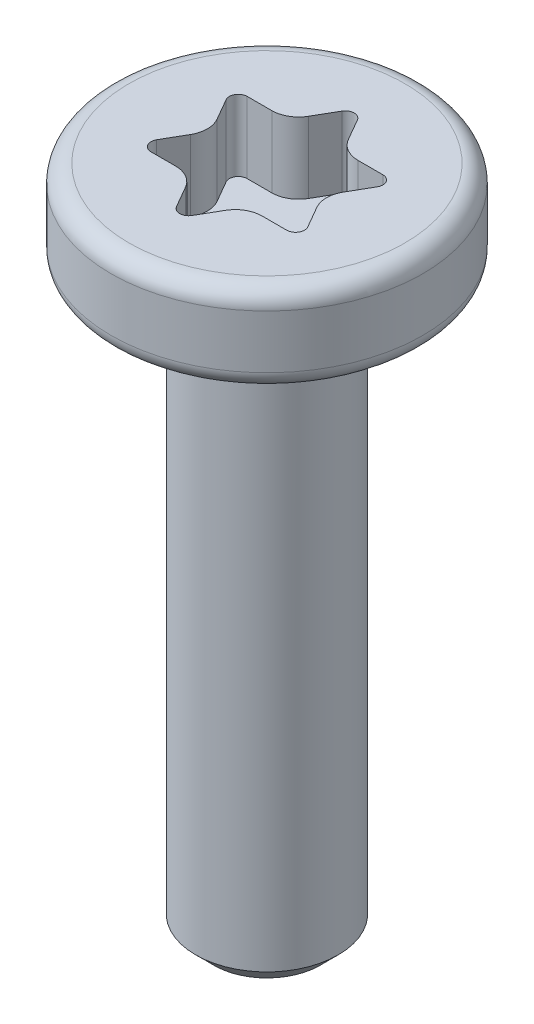
ISO-10303-21;
HEADER;
FILE_DESCRIPTION(('STEP AP214'),'2;1');
FILE_NAME('part.step','',(''),(''),'','','');
FILE_SCHEMA(('AUTOMOTIVE_DESIGN { 1 0 10303 214 1 1 1 1 }'));
ENDSEC;
DATA;
#1=APPLICATION_CONTEXT('core data for automotive mechanical design processes');
#2=APPLICATION_PROTOCOL_DEFINITION('international standard','automotive_design',2000,#1);
#3=PRODUCT_CONTEXT('',#1,'mechanical');
#4=PRODUCT('Part','Part','',(#3));
#5=PRODUCT_RELATED_PRODUCT_CATEGORY('part','',(#4));
#6=PRODUCT_DEFINITION_FORMATION('','',#4);
#7=PRODUCT_DEFINITION_CONTEXT('part definition',#1,'design');
#8=PRODUCT_DEFINITION('design','',#6,#7);
#9=PRODUCT_DEFINITION_SHAPE('','',#8);
#10=(LENGTH_UNIT() NAMED_UNIT(*) SI_UNIT(.MILLI.,.METRE.));
#11=(NAMED_UNIT(*) PLANE_ANGLE_UNIT() SI_UNIT($,.RADIAN.));
#12=(NAMED_UNIT(*) SI_UNIT($,.STERADIAN.) SOLID_ANGLE_UNIT());
#13=UNCERTAINTY_MEASURE_WITH_UNIT(LENGTH_MEASURE(1.E-05),#10,'distance_accuracy_value','');
#14=(GEOMETRIC_REPRESENTATION_CONTEXT(3) GLOBAL_UNCERTAINTY_ASSIGNED_CONTEXT((#13)) GLOBAL_UNIT_ASSIGNED_CONTEXT((#10,
#11,#12)) REPRESENTATION_CONTEXT('',''));
#15=CARTESIAN_POINT('',(0.,0.,0.));
#16=DIRECTION('',(0.,0.,1.));
#17=DIRECTION('',(1.,0.,0.));
#18=AXIS2_PLACEMENT_3D('',#15,#16,#17);
#19=CARTESIAN_POINT('',(0.,0.,0.));
#20=DIRECTION('',(0.,1.,0.));
#21=DIRECTION('',(0.,0.,1.));
#22=AXIS2_PLACEMENT_3D('',#19,#20,#21);
#23=PLANE('',#22);
#24=CARTESIAN_POINT('',(0.,0.,0.));
#25=DIRECTION('',(0.,1.,0.));
#26=DIRECTION('',(0.,0.,1.));
#27=AXIS2_PLACEMENT_3D('',#24,#25,#26);
#28=CIRCLE('',#27,1.55);
#29=CARTESIAN_POINT('',(0.,0.,1.55));
#30=VERTEX_POINT('',#29);
#31=EDGE_CURVE('E241',#30,#30,#28,.F.);
#32=ORIENTED_EDGE('',*,*,#31,.T.);
#33=EDGE_LOOP('',(#32));
#34=FACE_BOUND('',#33,.T.);
#35=CARTESIAN_POINT('',(0.,0.,0.));
#36=DIRECTION('',(0.,1.,0.));
#37=DIRECTION('',(0.,0.,1.));
#38=AXIS2_PLACEMENT_3D('',#35,#36,#37);
#39=CIRCLE('',#38,0.8);
#40=CARTESIAN_POINT('',(0.,0.,0.8));
#41=VERTEX_POINT('',#40);
#42=EDGE_CURVE('E247',#41,#41,#39,.F.);
#43=ORIENTED_EDGE('',*,*,#42,.F.);
#44=EDGE_LOOP('',(#43));
#45=FACE_BOUND('',#44,.T.);
#46=ADVANCED_FACE('F16',(#34,#45),#23,.F.);
#47=CARTESIAN_POINT('',(0.,1.,0.));
#48=DIRECTION('',(0.,-1.,0.));
#49=DIRECTION('',(0.,0.,-1.));
#50=AXIS2_PLACEMENT_3D('',#47,#48,#49);
#51=CYLINDRICAL_SURFACE('',#50,1.75);
#52=CARTESIAN_POINT('',(0.,0.2,0.));
#53=DIRECTION('',(0.,1.,0.));
#54=DIRECTION('',(0.,0.,1.));
#55=AXIS2_PLACEMENT_3D('',#52,#53,#54);
#56=CIRCLE('',#55,1.75);
#57=CARTESIAN_POINT('',(0.,0.2,1.75));
#58=VERTEX_POINT('',#57);
#59=EDGE_CURVE('E238',#58,#58,#56,.T.);
#60=ORIENTED_EDGE('',*,*,#59,.T.);
#61=EDGE_LOOP('',(#60));
#62=FACE_BOUND('',#61,.T.);
#63=CARTESIAN_POINT('',(0.,0.8,0.));
#64=DIRECTION('',(0.,1.,0.));
#65=DIRECTION('',(0.,0.,1.));
#66=AXIS2_PLACEMENT_3D('',#63,#64,#65);
#67=CIRCLE('',#66,1.75);
#68=CARTESIAN_POINT('',(0.,0.8,1.75));
#69=VERTEX_POINT('',#68);
#70=EDGE_CURVE('E235',#69,#69,#67,.F.);
#71=ORIENTED_EDGE('',*,*,#70,.T.);
#72=EDGE_LOOP('',(#71));
#73=FACE_BOUND('',#72,.T.);
#74=ADVANCED_FACE('F383',(#62,#73),#51,.T.);
#75=CARTESIAN_POINT('',(0.,1.,0.));
#76=DIRECTION('',(0.,1.,0.));
#77=DIRECTION('',(0.,0.,1.));
#78=AXIS2_PLACEMENT_3D('',#75,#76,#77);
#79=PLANE('',#78);
#80=DIRECTION('',(1.,0.,0.));
#81=VECTOR('',#80,1.);
#82=CARTESIAN_POINT('',(0.,1.,-0.539703745069974));
#83=LINE('',#82,#81);
#84=CARTESIAN_POINT('',(-0.761589226739509,1.,-0.539703745069974));
#85=VERTEX_POINT('',#84);
#86=CARTESIAN_POINT('',(-0.484803183255687,1.,-0.539703745069974));
#87=VERTEX_POINT('',#86);
#88=EDGE_CURVE('E229',#85,#87,#83,.T.);
#89=ORIENTED_EDGE('',*,*,#88,.T.);
#90=CARTESIAN_POINT('',(-0.484803183255687,1.,-0.839703745069974));
#91=DIRECTION('',(0.,1.,0.));
#92=DIRECTION('',(0.,0.,1.));
#93=AXIS2_PLACEMENT_3D('',#90,#91,#92);
#94=CIRCLE('',#93,0.3);
#95=CARTESIAN_POINT('',(-0.224995562120355,1.,-0.689703745069975));
#96=VERTEX_POINT('',#95);
#97=EDGE_CURVE('E320',#87,#96,#94,.T.);
#98=ORIENTED_EDGE('',*,*,#97,.T.);
#99=DIRECTION('',(-0.5,0.,0.866025403784439));
#100=VECTOR('',#99,1.);
#101=CARTESIAN_POINT('',(-0.467397153748198,1.,-0.269851872534987));
#102=LINE('',#101,#100);
#103=CARTESIAN_POINT('',(-0.0866025403784437,1.,-0.929407490139949));
#104=VERTEX_POINT('',#103);
#105=EDGE_CURVE('E226',#104,#96,#102,.T.);
#106=ORIENTED_EDGE('',*,*,#105,.F.);
#107=CARTESIAN_POINT('',(0.,1.,-0.879407490139948));
#108=DIRECTION('',(0.,1.,0.));
#109=DIRECTION('',(0.,0.,1.));
#110=AXIS2_PLACEMENT_3D('',#107,#108,#109);
#111=CIRCLE('',#110,0.1);
#112=CARTESIAN_POINT('',(0.0866025403784436,1.,-0.929407490139949));
#113=VERTEX_POINT('',#112);
#114=EDGE_CURVE('E303',#104,#113,#111,.F.);
#115=ORIENTED_EDGE('',*,*,#114,.T.);
#116=DIRECTION('',(-0.5,0.,-0.866025403784439));
#117=VECTOR('',#116,1.);
#118=CARTESIAN_POINT('',(0.467397153748198,1.,-0.269851872534987));
#119=LINE('',#118,#117);
#120=CARTESIAN_POINT('',(0.224995562120354,1.,-0.689703745069975));
#121=VERTEX_POINT('',#120);
#122=EDGE_CURVE('E224',#121,#113,#119,.T.);
#123=ORIENTED_EDGE('',*,*,#122,.F.);
#124=CARTESIAN_POINT('',(0.484803183255686,1.,-0.839703745069974));
#125=DIRECTION('',(0.,1.,0.));
#126=DIRECTION('',(0.,0.,1.));
#127=AXIS2_PLACEMENT_3D('',#124,#125,#126);
#128=CIRCLE('',#127,0.3);
#129=CARTESIAN_POINT('',(0.484803183255686,1.,-0.539703745069974));
#130=VERTEX_POINT('',#129);
#131=EDGE_CURVE('E318',#121,#130,#128,.T.);
#132=ORIENTED_EDGE('',*,*,#131,.T.);
#133=DIRECTION('',(1.,0.,0.));
#134=VECTOR('',#133,1.);
#135=CARTESIAN_POINT('',(0.,1.,-0.539703745069974));
#136=LINE('',#135,#134);
#137=CARTESIAN_POINT('',(0.761589226739509,1.,-0.539703745069974));
#138=VERTEX_POINT('',#137);
#139=EDGE_CURVE('E222',#130,#138,#136,.T.);
#140=ORIENTED_EDGE('',*,*,#139,.T.);
#141=CARTESIAN_POINT('',(0.761589226739509,1.,-0.439703745069975));
#142=DIRECTION('',(0.,1.,0.));
#143=DIRECTION('',(0.,0.,1.));
#144=AXIS2_PLACEMENT_3D('',#141,#142,#143);
#145=CIRCLE('',#144,0.1);
#146=CARTESIAN_POINT('',(0.848191767117953,1.,-0.389703745069975));
#147=VERTEX_POINT('',#146);
#148=EDGE_CURVE('E301',#138,#147,#145,.F.);
#149=ORIENTED_EDGE('',*,*,#148,.T.);
#150=DIRECTION('',(-0.5,0.,0.866025403784439));
#151=VECTOR('',#150,1.);
#152=CARTESIAN_POINT('',(0.467397153748198,1.,0.269851872534987));
#153=LINE('',#152,#151);
#154=CARTESIAN_POINT('',(0.709798745376042,1.,-0.15));
#155=VERTEX_POINT('',#154);
#156=EDGE_CURVE('E219',#147,#155,#153,.T.);
#157=ORIENTED_EDGE('',*,*,#156,.T.);
#158=CARTESIAN_POINT('',(0.969606366511373,1.,0.));
#159=DIRECTION('',(0.,1.,0.));
#160=DIRECTION('',(0.,0.,1.));
#161=AXIS2_PLACEMENT_3D('',#158,#159,#160);
#162=CIRCLE('',#161,0.3);
#163=CARTESIAN_POINT('',(0.709798745376042,1.,0.15));
#164=VERTEX_POINT('',#163);
#165=EDGE_CURVE('E316',#155,#164,#162,.T.);
#166=ORIENTED_EDGE('',*,*,#165,.T.);
#167=DIRECTION('',(-0.5,0.,-0.866025403784439));
#168=VECTOR('',#167,1.);
#169=CARTESIAN_POINT('',(0.467397153748198,1.,-0.269851872534987));
#170=LINE('',#169,#168);
#171=CARTESIAN_POINT('',(0.848191767117953,1.,0.389703745069975));
#172=VERTEX_POINT('',#171);
#173=EDGE_CURVE('E216',#172,#164,#170,.T.);
#174=ORIENTED_EDGE('',*,*,#173,.F.);
#175=CARTESIAN_POINT('',(0.761589226739509,1.,0.439703745069975));
#176=DIRECTION('',(0.,1.,0.));
#177=DIRECTION('',(0.,0.,1.));
#178=AXIS2_PLACEMENT_3D('',#175,#176,#177);
#179=CIRCLE('',#178,0.1);
#180=CARTESIAN_POINT('',(0.761589226739509,1.,0.539703745069974));
#181=VERTEX_POINT('',#180);
#182=EDGE_CURVE('E298',#172,#181,#179,.F.);
#183=ORIENTED_EDGE('',*,*,#182,.T.);
#184=DIRECTION('',(1.,0.,0.));
#185=VECTOR('',#184,1.);
#186=CARTESIAN_POINT('',(0.,1.,0.539703745069974));
#187=LINE('',#186,#185);
#188=CARTESIAN_POINT('',(0.484803183255687,1.,0.539703745069974));
#189=VERTEX_POINT('',#188);
#190=EDGE_CURVE('E214',#189,#181,#187,.T.);
#191=ORIENTED_EDGE('',*,*,#190,.F.);
#192=CARTESIAN_POINT('',(0.484803183255687,1.,0.839703745069974));
#193=DIRECTION('',(0.,1.,0.));
#194=DIRECTION('',(0.,0.,1.));
#195=AXIS2_PLACEMENT_3D('',#192,#193,#194);
#196=CIRCLE('',#195,0.3);
#197=CARTESIAN_POINT('',(0.224995562120355,1.,0.689703745069975));
#198=VERTEX_POINT('',#197);
#199=EDGE_CURVE('E314',#189,#198,#196,.T.);
#200=ORIENTED_EDGE('',*,*,#199,.T.);
#201=DIRECTION('',(-0.5,0.,0.866025403784439));
#202=VECTOR('',#201,1.);
#203=CARTESIAN_POINT('',(0.467397153748198,1.,0.269851872534987));
#204=LINE('',#203,#202);
#205=CARTESIAN_POINT('',(0.0866025403784437,1.,0.929407490139949));
#206=VERTEX_POINT('',#205);
#207=EDGE_CURVE('E207',#198,#206,#204,.T.);
#208=ORIENTED_EDGE('',*,*,#207,.T.);
#209=CARTESIAN_POINT('',(0.,1.,0.879407490139949));
#210=DIRECTION('',(0.,1.,0.));
#211=DIRECTION('',(0.,0.,1.));
#212=AXIS2_PLACEMENT_3D('',#209,#210,#211);
#213=CIRCLE('',#212,0.1);
#214=CARTESIAN_POINT('',(-0.0866025403784436,1.,0.929407490139949));
#215=VERTEX_POINT('',#214);
#216=EDGE_CURVE('E187',#206,#215,#213,.F.);
#217=ORIENTED_EDGE('',*,*,#216,.T.);
#218=DIRECTION('',(-0.5,0.,-0.866025403784439));
#219=VECTOR('',#218,1.);
#220=CARTESIAN_POINT('',(-0.467397153748198,1.,0.269851872534987));
#221=LINE('',#220,#219);
#222=CARTESIAN_POINT('',(-0.224995562120355,1.,0.689703745069975));
#223=VERTEX_POINT('',#222);
#224=EDGE_CURVE('E205',#215,#223,#221,.T.);
#225=ORIENTED_EDGE('',*,*,#224,.T.);
#226=CARTESIAN_POINT('',(-0.484803183255686,1.,0.839703745069974));
#227=DIRECTION('',(0.,1.,0.));
#228=DIRECTION('',(0.,0.,1.));
#229=AXIS2_PLACEMENT_3D('',#226,#227,#228);
#230=CIRCLE('',#229,0.3);
#231=CARTESIAN_POINT('',(-0.484803183255686,1.,0.539703745069974));
#232=VERTEX_POINT('',#231);
#233=EDGE_CURVE('E204',#223,#232,#230,.T.);
#234=ORIENTED_EDGE('',*,*,#233,.T.);
#235=DIRECTION('',(1.,0.,0.));
#236=VECTOR('',#235,1.);
#237=CARTESIAN_POINT('',(0.,1.,0.539703745069974));
#238=LINE('',#237,#236);
#239=CARTESIAN_POINT('',(-0.761589226739509,1.,0.539703745069974));
#240=VERTEX_POINT('',#239);
#241=EDGE_CURVE('E194',#240,#232,#238,.T.);
#242=ORIENTED_EDGE('',*,*,#241,.F.);
#243=CARTESIAN_POINT('',(-0.761589226739509,1.,0.439703745069975));
#244=DIRECTION('',(0.,1.,0.));
#245=DIRECTION('',(0.,0.,1.));
#246=AXIS2_PLACEMENT_3D('',#243,#244,#245);
#247=CIRCLE('',#246,0.1);
#248=CARTESIAN_POINT('',(-0.848191767117953,1.,0.389703745069975));
#249=VERTEX_POINT('',#248);
#250=EDGE_CURVE('E177',#240,#249,#247,.F.);
#251=ORIENTED_EDGE('',*,*,#250,.T.);
#252=DIRECTION('',(-0.5,0.,0.866025403784439));
#253=VECTOR('',#252,1.);
#254=CARTESIAN_POINT('',(-0.467397153748198,1.,-0.269851872534987));
#255=LINE('',#254,#253);
#256=CARTESIAN_POINT('',(-0.709798745376042,1.,0.15));
#257=VERTEX_POINT('',#256);
#258=EDGE_CURVE('E233',#257,#249,#255,.T.);
#259=ORIENTED_EDGE('',*,*,#258,.F.);
#260=CARTESIAN_POINT('',(-0.969606366511373,1.,0.));
#261=DIRECTION('',(0.,1.,0.));
#262=DIRECTION('',(0.,0.,1.));
#263=AXIS2_PLACEMENT_3D('',#260,#261,#262);
#264=CIRCLE('',#263,0.3);
#265=CARTESIAN_POINT('',(-0.709798745376042,1.,-0.15));
#266=VERTEX_POINT('',#265);
#267=EDGE_CURVE('E311',#257,#266,#264,.T.);
#268=ORIENTED_EDGE('',*,*,#267,.T.);
#269=DIRECTION('',(-0.5,0.,-0.866025403784439));
#270=VECTOR('',#269,1.);
#271=CARTESIAN_POINT('',(-0.467397153748198,1.,0.269851872534987));
#272=LINE('',#271,#270);
#273=CARTESIAN_POINT('',(-0.848191767117953,1.,-0.389703745069975));
#274=VERTEX_POINT('',#273);
#275=EDGE_CURVE('E231',#266,#274,#272,.T.);
#276=ORIENTED_EDGE('',*,*,#275,.T.);
#277=CARTESIAN_POINT('',(-0.761589226739509,1.,-0.439703745069974));
#278=DIRECTION('',(0.,1.,0.));
#279=DIRECTION('',(0.,0.,1.));
#280=AXIS2_PLACEMENT_3D('',#277,#278,#279);
#281=CIRCLE('',#280,0.1);
#282=EDGE_CURVE('E306',#274,#85,#281,.F.);
#283=ORIENTED_EDGE('',*,*,#282,.T.);
#284=EDGE_LOOP('',(#89,#98,#106,#115,#123,#132,#140,#149,#157,#166,#174,#183,#191,#200,#208,
#217,#225,#234,#242,#251,#259,#268,#276,#283));
#285=FACE_BOUND('',#284,.T.);
#286=CARTESIAN_POINT('',(0.,1.,0.));
#287=DIRECTION('',(0.,1.,0.));
#288=DIRECTION('',(0.,0.,1.));
#289=AXIS2_PLACEMENT_3D('',#286,#287,#288);
#290=CIRCLE('',#289,1.55);
#291=CARTESIAN_POINT('',(0.,1.,1.55));
#292=VERTEX_POINT('',#291);
#293=EDGE_CURVE('E244',#292,#292,#290,.T.);
#294=ORIENTED_EDGE('',*,*,#293,.T.);
#295=EDGE_LOOP('',(#294));
#296=FACE_BOUND('',#295,.T.);
#297=ADVANCED_FACE('F201',(#285,#296),#79,.T.);
#298=CARTESIAN_POINT('',(0.,0.2,0.));
#299=DIRECTION('',(0.,1.,0.));
#300=DIRECTION('',(0.,0.,1.));
#301=AXIS2_PLACEMENT_3D('',#298,#299,#300);
#302=TOROIDAL_SURFACE('',#301,1.55,0.2);
#303=ORIENTED_EDGE('',*,*,#31,.F.);
#304=EDGE_LOOP('',(#303));
#305=FACE_BOUND('',#304,.T.);
#306=ORIENTED_EDGE('',*,*,#59,.F.);
#307=EDGE_LOOP('',(#306));
#308=FACE_BOUND('',#307,.T.);
#309=ADVANCED_FACE('F396',(#305,#308),#302,.T.);
#310=CARTESIAN_POINT('',(0.,0.8,0.));
#311=DIRECTION('',(0.,1.,0.));
#312=DIRECTION('',(0.,0.,1.));
#313=AXIS2_PLACEMENT_3D('',#310,#311,#312);
#314=TOROIDAL_SURFACE('',#313,1.55,0.2);
#315=ORIENTED_EDGE('',*,*,#70,.F.);
#316=EDGE_LOOP('',(#315));
#317=FACE_BOUND('',#316,.T.);
#318=ORIENTED_EDGE('',*,*,#293,.F.);
#319=EDGE_LOOP('',(#318));
#320=FACE_BOUND('',#319,.T.);
#321=ADVANCED_FACE('F399',(#317,#320),#314,.T.);
#322=CARTESIAN_POINT('',(0.,-6.5,0.));
#323=DIRECTION('',(0.,1.,0.));
#324=DIRECTION('',(0.,0.,1.));
#325=AXIS2_PLACEMENT_3D('',#322,#323,#324);
#326=CYLINDRICAL_SURFACE('',#325,0.8);
#327=CARTESIAN_POINT('',(0.,-6.3,0.));
#328=DIRECTION('',(0.,-1.,0.));
#329=DIRECTION('',(0.,0.,-1.));
#330=AXIS2_PLACEMENT_3D('',#327,#328,#329);
#331=CIRCLE('',#330,0.8);
#332=CARTESIAN_POINT('',(0.,-6.3,-0.8));
#333=VERTEX_POINT('',#332);
#334=EDGE_CURVE('E198',#333,#333,#331,.F.);
#335=ORIENTED_EDGE('',*,*,#334,.T.);
#336=EDGE_LOOP('',(#335));
#337=FACE_BOUND('',#336,.T.);
#338=ORIENTED_EDGE('',*,*,#42,.T.);
#339=EDGE_LOOP('',(#338));
#340=FACE_BOUND('',#339,.T.);
#341=ADVANCED_FACE('F403',(#337,#340),#326,.T.);
#342=CARTESIAN_POINT('',(0.,-6.5,0.));
#343=DIRECTION('',(0.,-1.,0.));
#344=DIRECTION('',(0.,0.,-1.));
#345=AXIS2_PLACEMENT_3D('',#342,#343,#344);
#346=PLANE('',#345);
#347=CARTESIAN_POINT('',(0.,-6.5,0.));
#348=DIRECTION('',(0.,-1.,0.));
#349=DIRECTION('',(0.,0.,-1.));
#350=AXIS2_PLACEMENT_3D('',#347,#348,#349);
#351=CIRCLE('',#350,0.6);
#352=CARTESIAN_POINT('',(0.,-6.5,-0.6));
#353=VERTEX_POINT('',#352);
#354=EDGE_CURVE('E250',#353,#353,#351,.T.);
#355=ORIENTED_EDGE('',*,*,#354,.T.);
#356=EDGE_LOOP('',(#355));
#357=FACE_BOUND('',#356,.T.);
#358=ADVANCED_FACE('F408',(#357),#346,.T.);
#359=CARTESIAN_POINT('',(0.,-6.5,0.));
#360=DIRECTION('',(0.,1.,0.));
#361=DIRECTION('',(0.,0.,1.));
#362=AXIS2_PLACEMENT_3D('',#359,#360,#361);
#363=CONICAL_SURFACE('',#362,0.6,0.785398163397448);
#364=ORIENTED_EDGE('',*,*,#334,.F.);
#365=EDGE_LOOP('',(#364));
#366=FACE_BOUND('',#365,.T.);
#367=ORIENTED_EDGE('',*,*,#354,.F.);
#368=EDGE_LOOP('',(#367));
#369=FACE_BOUND('',#368,.T.);
#370=ADVANCED_FACE('F405',(#366,#369),#363,.T.);
#371=CARTESIAN_POINT('',(0.,0.2,0.539703745069974));
#372=DIRECTION('',(0.,0.,1.));
#373=DIRECTION('',(1.,0.,0.));
#374=AXIS2_PLACEMENT_3D('',#371,#372,#373);
#375=PLANE('',#374);
#376=ORIENTED_EDGE('',*,*,#241,.T.);
#377=DIRECTION('',(0.,1.,0.));
#378=VECTOR('',#377,1.);
#379=CARTESIAN_POINT('',(-0.484803183255686,0.2,0.539703745069974));
#380=LINE('',#379,#378);
#381=CARTESIAN_POINT('',(-0.484803183255686,0.2,0.539703745069974));
#382=VERTEX_POINT('',#381);
#383=EDGE_CURVE('E342',#232,#382,#380,.F.);
#384=ORIENTED_EDGE('',*,*,#383,.T.);
#385=DIRECTION('',(1.,0.,0.));
#386=VECTOR('',#385,1.);
#387=CARTESIAN_POINT('',(0.,0.2,0.539703745069974));
#388=LINE('',#387,#386);
#389=CARTESIAN_POINT('',(-0.761589226739509,0.2,0.539703745069974));
#390=VERTEX_POINT('',#389);
#391=EDGE_CURVE('E197',#390,#382,#388,.T.);
#392=ORIENTED_EDGE('',*,*,#391,.F.);
#393=DIRECTION('',(0.,1.,0.));
#394=VECTOR('',#393,1.);
#395=CARTESIAN_POINT('',(-0.761589226739509,1.,0.539703745069974));
#396=LINE('',#395,#394);
#397=EDGE_CURVE('E181',#390,#240,#396,.T.);
#398=ORIENTED_EDGE('',*,*,#397,.T.);
#399=EDGE_LOOP('',(#376,#384,#392,#398));
#400=FACE_BOUND('',#399,.T.);
#401=ADVANCED_FACE('F193',(#400),#375,.F.);
#402=CARTESIAN_POINT('',(-0.467397153748198,0.2,-0.269851872534987));
#403=DIRECTION('',(-0.866025403784439,0.,-0.5));
#404=DIRECTION('',(-0.5,0.,0.866025403784439));
#405=AXIS2_PLACEMENT_3D('',#402,#403,#404);
#406=PLANE('',#405);
#407=DIRECTION('',(-0.5,0.,0.866025403784439));
#408=VECTOR('',#407,1.);
#409=CARTESIAN_POINT('',(-0.467397153748198,0.2,-0.269851872534987));
#410=LINE('',#409,#408);
#411=CARTESIAN_POINT('',(-0.709798745376042,0.2,0.15));
#412=VERTEX_POINT('',#411);
#413=CARTESIAN_POINT('',(-0.848191767117953,0.2,0.389703745069975));
#414=VERTEX_POINT('',#413);
#415=EDGE_CURVE('E210',#412,#414,#410,.T.);
#416=ORIENTED_EDGE('',*,*,#415,.F.);
#417=DIRECTION('',(0.,1.,0.));
#418=VECTOR('',#417,1.);
#419=CARTESIAN_POINT('',(-0.709798745376042,1.,0.15));
#420=LINE('',#419,#418);
#421=EDGE_CURVE('E344',#412,#257,#420,.T.);
#422=ORIENTED_EDGE('',*,*,#421,.T.);
#423=ORIENTED_EDGE('',*,*,#258,.T.);
#424=DIRECTION('',(0.,1.,0.));
#425=VECTOR('',#424,1.);
#426=CARTESIAN_POINT('',(-0.848191767117953,0.2,0.389703745069975));
#427=LINE('',#426,#425);
#428=EDGE_CURVE('E183',#249,#414,#427,.F.);
#429=ORIENTED_EDGE('',*,*,#428,.T.);
#430=EDGE_LOOP('',(#416,#422,#423,#429));
#431=FACE_BOUND('',#430,.T.);
#432=ADVANCED_FACE('F476',(#431),#406,.F.);
#433=CARTESIAN_POINT('',(-0.467397153748198,0.2,0.269851872534987));
#434=DIRECTION('',(0.866025403784439,0.,-0.5));
#435=DIRECTION('',(-0.5,0.,-0.866025403784439));
#436=AXIS2_PLACEMENT_3D('',#433,#434,#435);
#437=PLANE('',#436);
#438=ORIENTED_EDGE('',*,*,#275,.F.);
#439=DIRECTION('',(0.,1.,0.));
#440=VECTOR('',#439,1.);
#441=CARTESIAN_POINT('',(-0.709798745376042,0.2,-0.15));
#442=LINE('',#441,#440);
#443=CARTESIAN_POINT('',(-0.709798745376042,0.2,-0.15));
#444=VERTEX_POINT('',#443);
#445=EDGE_CURVE('E31',#266,#444,#442,.F.);
#446=ORIENTED_EDGE('',*,*,#445,.T.);
#447=DIRECTION('',(-0.5,0.,-0.866025403784439));
#448=VECTOR('',#447,1.);
#449=CARTESIAN_POINT('',(-0.467397153748198,0.2,0.269851872534987));
#450=LINE('',#449,#448);
#451=CARTESIAN_POINT('',(-0.848191767117953,0.2,-0.389703745069975));
#452=VERTEX_POINT('',#451);
#453=EDGE_CURVE('E473',#444,#452,#450,.T.);
#454=ORIENTED_EDGE('',*,*,#453,.T.);
#455=DIRECTION('',(0.,1.,0.));
#456=VECTOR('',#455,1.);
#457=CARTESIAN_POINT('',(-0.848191767117953,1.,-0.389703745069974));
#458=LINE('',#457,#456);
#459=EDGE_CURVE('E293',#452,#274,#458,.T.);
#460=ORIENTED_EDGE('',*,*,#459,.T.);
#461=EDGE_LOOP('',(#438,#446,#454,#460));
#462=FACE_BOUND('',#461,.T.);
#463=ADVANCED_FACE('F478',(#462),#437,.T.);
#464=CARTESIAN_POINT('',(0.,0.2,-0.539703745069974));
#465=DIRECTION('',(0.,0.,1.));
#466=DIRECTION('',(1.,0.,0.));
#467=AXIS2_PLACEMENT_3D('',#464,#465,#466);
#468=PLANE('',#467);
#469=DIRECTION('',(1.,0.,0.));
#470=VECTOR('',#469,1.);
#471=CARTESIAN_POINT('',(0.,0.2,-0.539703745069974));
#472=LINE('',#471,#470);
#473=CARTESIAN_POINT('',(-0.761589226739509,0.2,-0.539703745069974));
#474=VERTEX_POINT('',#473);
#475=CARTESIAN_POINT('',(-0.484803183255687,0.2,-0.539703745069974));
#476=VERTEX_POINT('',#475);
#477=EDGE_CURVE('E471',#474,#476,#472,.T.);
#478=ORIENTED_EDGE('',*,*,#477,.T.);
#479=DIRECTION('',(0.,1.,0.));
#480=VECTOR('',#479,1.);
#481=CARTESIAN_POINT('',(-0.484803183255687,1.,-0.539703745069974));
#482=LINE('',#481,#480);
#483=EDGE_CURVE('E308',#476,#87,#482,.T.);
#484=ORIENTED_EDGE('',*,*,#483,.T.);
#485=ORIENTED_EDGE('',*,*,#88,.F.);
#486=DIRECTION('',(0.,1.,0.));
#487=VECTOR('',#486,1.);
#488=CARTESIAN_POINT('',(-0.761589226739509,0.2,-0.539703745069974));
#489=LINE('',#488,#487);
#490=EDGE_CURVE('E188',#85,#474,#489,.F.);
#491=ORIENTED_EDGE('',*,*,#490,.T.);
#492=EDGE_LOOP('',(#478,#484,#485,#491));
#493=FACE_BOUND('',#492,.T.);
#494=ADVANCED_FACE('F484',(#493),#468,.T.);
#495=CARTESIAN_POINT('',(-0.467397153748198,0.2,-0.269851872534987));
#496=DIRECTION('',(-0.866025403784439,0.,-0.5));
#497=DIRECTION('',(-0.5,0.,0.866025403784439));
#498=AXIS2_PLACEMENT_3D('',#495,#496,#497);
#499=PLANE('',#498);
#500=ORIENTED_EDGE('',*,*,#105,.T.);
#501=DIRECTION('',(0.,1.,0.));
#502=VECTOR('',#501,1.);
#503=CARTESIAN_POINT('',(-0.224995562120355,0.2,-0.689703745069974));
#504=LINE('',#503,#502);
#505=CARTESIAN_POINT('',(-0.224995562120355,0.2,-0.689703745069975));
#506=VERTEX_POINT('',#505);
#507=EDGE_CURVE('E322',#96,#506,#504,.F.);
#508=ORIENTED_EDGE('',*,*,#507,.T.);
#509=DIRECTION('',(-0.5,0.,0.866025403784439));
#510=VECTOR('',#509,1.);
#511=CARTESIAN_POINT('',(-0.467397153748198,0.2,-0.269851872534987));
#512=LINE('',#511,#510);
#513=CARTESIAN_POINT('',(-0.0866025403784437,0.2,-0.929407490139949));
#514=VERTEX_POINT('',#513);
#515=EDGE_CURVE('E468',#514,#506,#512,.T.);
#516=ORIENTED_EDGE('',*,*,#515,.F.);
#517=DIRECTION('',(0.,1.,0.));
#518=VECTOR('',#517,1.);
#519=CARTESIAN_POINT('',(-0.0866025403784439,1.,-0.929407490139948));
#520=LINE('',#519,#518);
#521=EDGE_CURVE('E287',#514,#104,#520,.T.);
#522=ORIENTED_EDGE('',*,*,#521,.T.);
#523=EDGE_LOOP('',(#500,#508,#516,#522));
#524=FACE_BOUND('',#523,.T.);
#525=ADVANCED_FACE('F491',(#524),#499,.F.);
#526=CARTESIAN_POINT('',(0.467397153748198,0.2,-0.269851872534987));
#527=DIRECTION('',(0.866025403784439,0.,-0.5));
#528=DIRECTION('',(-0.5,0.,-0.866025403784439));
#529=AXIS2_PLACEMENT_3D('',#526,#527,#528);
#530=PLANE('',#529);
#531=DIRECTION('',(-0.5,0.,-0.866025403784439));
#532=VECTOR('',#531,1.);
#533=CARTESIAN_POINT('',(0.467397153748198,0.2,-0.269851872534987));
#534=LINE('',#533,#532);
#535=CARTESIAN_POINT('',(0.224995562120354,0.2,-0.689703745069975));
#536=VERTEX_POINT('',#535);
#537=CARTESIAN_POINT('',(0.0866025403784436,0.2,-0.929407490139949));
#538=VERTEX_POINT('',#537);
#539=EDGE_CURVE('E461',#536,#538,#534,.T.);
#540=ORIENTED_EDGE('',*,*,#539,.F.);
#541=DIRECTION('',(0.,1.,0.));
#542=VECTOR('',#541,1.);
#543=CARTESIAN_POINT('',(0.224995562120354,1.,-0.689703745069974));
#544=LINE('',#543,#542);
#545=EDGE_CURVE('E324',#536,#121,#544,.T.);
#546=ORIENTED_EDGE('',*,*,#545,.T.);
#547=ORIENTED_EDGE('',*,*,#122,.T.);
#548=DIRECTION('',(0.,1.,0.));
#549=VECTOR('',#548,1.);
#550=CARTESIAN_POINT('',(0.0866025403784438,0.2,-0.929407490139948));
#551=LINE('',#550,#549);
#552=EDGE_CURVE('E290',#113,#538,#551,.F.);
#553=ORIENTED_EDGE('',*,*,#552,.T.);
#554=EDGE_LOOP('',(#540,#546,#547,#553));
#555=FACE_BOUND('',#554,.T.);
#556=ADVANCED_FACE('F500',(#555),#530,.F.);
#557=CARTESIAN_POINT('',(0.,0.2,-0.539703745069974));
#558=DIRECTION('',(0.,0.,1.));
#559=DIRECTION('',(1.,0.,0.));
#560=AXIS2_PLACEMENT_3D('',#557,#558,#559);
#561=PLANE('',#560);
#562=ORIENTED_EDGE('',*,*,#139,.F.);
#563=DIRECTION('',(0.,1.,0.));
#564=VECTOR('',#563,1.);
#565=CARTESIAN_POINT('',(0.484803183255686,0.2,-0.539703745069974));
#566=LINE('',#565,#564);
#567=CARTESIAN_POINT('',(0.484803183255686,0.2,-0.539703745069974));
#568=VERTEX_POINT('',#567);
#569=EDGE_CURVE('E327',#130,#568,#566,.F.);
#570=ORIENTED_EDGE('',*,*,#569,.T.);
#571=DIRECTION('',(1.,0.,0.));
#572=VECTOR('',#571,1.);
#573=CARTESIAN_POINT('',(0.,0.2,-0.539703745069974));
#574=LINE('',#573,#572);
#575=CARTESIAN_POINT('',(0.761589226739509,0.2,-0.539703745069974));
#576=VERTEX_POINT('',#575);
#577=EDGE_CURVE('E459',#568,#576,#574,.T.);
#578=ORIENTED_EDGE('',*,*,#577,.T.);
#579=DIRECTION('',(0.,1.,0.));
#580=VECTOR('',#579,1.);
#581=CARTESIAN_POINT('',(0.761589226739509,1.,-0.539703745069974));
#582=LINE('',#581,#580);
#583=EDGE_CURVE('E282',#576,#138,#582,.T.);
#584=ORIENTED_EDGE('',*,*,#583,.T.);
#585=EDGE_LOOP('',(#562,#570,#578,#584));
#586=FACE_BOUND('',#585,.T.);
#587=ADVANCED_FACE('F506',(#586),#561,.T.);
#588=CARTESIAN_POINT('',(0.467397153748198,0.2,0.269851872534987));
#589=DIRECTION('',(-0.866025403784439,0.,-0.5));
#590=DIRECTION('',(-0.5,0.,0.866025403784439));
#591=AXIS2_PLACEMENT_3D('',#588,#589,#590);
#592=PLANE('',#591);
#593=DIRECTION('',(-0.5,0.,0.866025403784439));
#594=VECTOR('',#593,1.);
#595=CARTESIAN_POINT('',(0.467397153748198,0.2,0.269851872534987));
#596=LINE('',#595,#594);
#597=CARTESIAN_POINT('',(0.848191767117953,0.2,-0.389703745069975));
#598=VERTEX_POINT('',#597);
#599=CARTESIAN_POINT('',(0.709798745376042,0.2,-0.15));
#600=VERTEX_POINT('',#599);
#601=EDGE_CURVE('E451',#598,#600,#596,.T.);
#602=ORIENTED_EDGE('',*,*,#601,.T.);
#603=DIRECTION('',(0.,1.,0.));
#604=VECTOR('',#603,1.);
#605=CARTESIAN_POINT('',(0.709798745376042,1.,-0.15));
#606=LINE('',#605,#604);
#607=EDGE_CURVE('E329',#600,#155,#606,.T.);
#608=ORIENTED_EDGE('',*,*,#607,.T.);
#609=ORIENTED_EDGE('',*,*,#156,.F.);
#610=DIRECTION('',(0.,1.,0.));
#611=VECTOR('',#610,1.);
#612=CARTESIAN_POINT('',(0.848191767117953,0.2,-0.389703745069975));
#613=LINE('',#612,#611);
#614=EDGE_CURVE('E285',#147,#598,#613,.F.);
#615=ORIENTED_EDGE('',*,*,#614,.T.);
#616=EDGE_LOOP('',(#602,#608,#609,#615));
#617=FACE_BOUND('',#616,.T.);
#618=ADVANCED_FACE('F456',(#617),#592,.T.);
#619=CARTESIAN_POINT('',(0.467397153748198,0.2,-0.269851872534987));
#620=DIRECTION('',(0.866025403784439,0.,-0.5));
#621=DIRECTION('',(-0.5,0.,-0.866025403784439));
#622=AXIS2_PLACEMENT_3D('',#619,#620,#621);
#623=PLANE('',#622);
#624=ORIENTED_EDGE('',*,*,#173,.T.);
#625=DIRECTION('',(0.,1.,0.));
#626=VECTOR('',#625,1.);
#627=CARTESIAN_POINT('',(0.709798745376042,0.2,0.15));
#628=LINE('',#627,#626);
#629=CARTESIAN_POINT('',(0.709798745376042,0.2,0.15));
#630=VERTEX_POINT('',#629);
#631=EDGE_CURVE('E332',#164,#630,#628,.F.);
#632=ORIENTED_EDGE('',*,*,#631,.T.);
#633=DIRECTION('',(-0.5,0.,-0.866025403784439));
#634=VECTOR('',#633,1.);
#635=CARTESIAN_POINT('',(0.467397153748198,0.2,-0.269851872534987));
#636=LINE('',#635,#634);
#637=CARTESIAN_POINT('',(0.848191767117953,0.2,0.389703745069975));
#638=VERTEX_POINT('',#637);
#639=EDGE_CURVE('E454',#638,#630,#636,.T.);
#640=ORIENTED_EDGE('',*,*,#639,.F.);
#641=DIRECTION('',(0.,1.,0.));
#642=VECTOR('',#641,1.);
#643=CARTESIAN_POINT('',(0.848191767117953,1.,0.389703745069975));
#644=LINE('',#643,#642);
#645=EDGE_CURVE('E276',#638,#172,#644,.T.);
#646=ORIENTED_EDGE('',*,*,#645,.T.);
#647=EDGE_LOOP('',(#624,#632,#640,#646));
#648=FACE_BOUND('',#647,.T.);
#649=ADVANCED_FACE('F511',(#648),#623,.F.);
#650=CARTESIAN_POINT('',(0.,0.2,0.539703745069974));
#651=DIRECTION('',(0.,0.,1.));
#652=DIRECTION('',(1.,0.,0.));
#653=AXIS2_PLACEMENT_3D('',#650,#651,#652);
#654=PLANE('',#653);
#655=DIRECTION('',(1.,0.,0.));
#656=VECTOR('',#655,1.);
#657=CARTESIAN_POINT('',(0.,0.2,0.539703745069974));
#658=LINE('',#657,#656);
#659=CARTESIAN_POINT('',(0.484803183255687,0.2,0.539703745069974));
#660=VERTEX_POINT('',#659);
#661=CARTESIAN_POINT('',(0.761589226739509,0.2,0.539703745069974));
#662=VERTEX_POINT('',#661);
#663=EDGE_CURVE('E463',#660,#662,#658,.T.);
#664=ORIENTED_EDGE('',*,*,#663,.F.);
#665=DIRECTION('',(0.,1.,0.));
#666=VECTOR('',#665,1.);
#667=CARTESIAN_POINT('',(0.484803183255687,1.,0.539703745069974));
#668=LINE('',#667,#666);
#669=EDGE_CURVE('E334',#660,#189,#668,.T.);
#670=ORIENTED_EDGE('',*,*,#669,.T.);
#671=ORIENTED_EDGE('',*,*,#190,.T.);
#672=DIRECTION('',(0.,1.,0.));
#673=VECTOR('',#672,1.);
#674=CARTESIAN_POINT('',(0.761589226739509,0.2,0.539703745069974));
#675=LINE('',#674,#673);
#676=EDGE_CURVE('E279',#181,#662,#675,.F.);
#677=ORIENTED_EDGE('',*,*,#676,.T.);
#678=EDGE_LOOP('',(#664,#670,#671,#677));
#679=FACE_BOUND('',#678,.T.);
#680=ADVANCED_FACE('F519',(#679),#654,.F.);
#681=CARTESIAN_POINT('',(0.467397153748198,0.2,0.269851872534987));
#682=DIRECTION('',(-0.866025403784439,0.,-0.5));
#683=DIRECTION('',(-0.5,0.,0.866025403784439));
#684=AXIS2_PLACEMENT_3D('',#681,#682,#683);
#685=PLANE('',#684);
#686=ORIENTED_EDGE('',*,*,#207,.F.);
#687=DIRECTION('',(0.,1.,0.));
#688=VECTOR('',#687,1.);
#689=CARTESIAN_POINT('',(0.224995562120355,0.2,0.689703745069974));
#690=LINE('',#689,#688);
#691=CARTESIAN_POINT('',(0.224995562120355,0.2,0.689703745069975));
#692=VERTEX_POINT('',#691);
#693=EDGE_CURVE('E337',#198,#692,#690,.F.);
#694=ORIENTED_EDGE('',*,*,#693,.T.);
#695=DIRECTION('',(-0.5,0.,0.866025403784439));
#696=VECTOR('',#695,1.);
#697=CARTESIAN_POINT('',(0.467397153748198,0.2,0.269851872534987));
#698=LINE('',#697,#696);
#699=CARTESIAN_POINT('',(0.0866025403784437,0.2,0.929407490139949));
#700=VERTEX_POINT('',#699);
#701=EDGE_CURVE('E367',#692,#700,#698,.T.);
#702=ORIENTED_EDGE('',*,*,#701,.T.);
#703=DIRECTION('',(0.,1.,0.));
#704=VECTOR('',#703,1.);
#705=CARTESIAN_POINT('',(0.0866025403784439,1.,0.929407490139949));
#706=LINE('',#705,#704);
#707=EDGE_CURVE('E271',#700,#206,#706,.T.);
#708=ORIENTED_EDGE('',*,*,#707,.T.);
#709=EDGE_LOOP('',(#686,#694,#702,#708));
#710=FACE_BOUND('',#709,.T.);
#711=ADVANCED_FACE('F525',(#710),#685,.T.);
#712=CARTESIAN_POINT('',(-0.467397153748198,0.2,0.269851872534987));
#713=DIRECTION('',(0.866025403784439,0.,-0.5));
#714=DIRECTION('',(-0.5,0.,-0.866025403784439));
#715=AXIS2_PLACEMENT_3D('',#712,#713,#714);
#716=PLANE('',#715);
#717=DIRECTION('',(-0.5,0.,-0.866025403784439));
#718=VECTOR('',#717,1.);
#719=CARTESIAN_POINT('',(-0.467397153748198,0.2,0.269851872534987));
#720=LINE('',#719,#718);
#721=CARTESIAN_POINT('',(-0.0866025403784436,0.2,0.929407490139949));
#722=VERTEX_POINT('',#721);
#723=CARTESIAN_POINT('',(-0.224995562120355,0.2,0.689703745069975));
#724=VERTEX_POINT('',#723);
#725=EDGE_CURVE('E359',#722,#724,#720,.T.);
#726=ORIENTED_EDGE('',*,*,#725,.T.);
#727=DIRECTION('',(0.,1.,0.));
#728=VECTOR('',#727,1.);
#729=CARTESIAN_POINT('',(-0.224995562120355,1.,0.689703745069974));
#730=LINE('',#729,#728);
#731=EDGE_CURVE('E339',#724,#223,#730,.T.);
#732=ORIENTED_EDGE('',*,*,#731,.T.);
#733=ORIENTED_EDGE('',*,*,#224,.F.);
#734=DIRECTION('',(0.,1.,0.));
#735=VECTOR('',#734,1.);
#736=CARTESIAN_POINT('',(-0.0866025403784438,0.2,0.929407490139949));
#737=LINE('',#736,#735);
#738=EDGE_CURVE('E274',#215,#722,#737,.F.);
#739=ORIENTED_EDGE('',*,*,#738,.T.);
#740=EDGE_LOOP('',(#726,#732,#733,#739));
#741=FACE_BOUND('',#740,.T.);
#742=ADVANCED_FACE('F364',(#741),#716,.T.);
#743=CARTESIAN_POINT('',(0.,0.2,0.));
#744=DIRECTION('',(0.,1.,0.));
#745=DIRECTION('',(0.,0.,1.));
#746=AXIS2_PLACEMENT_3D('',#743,#744,#745);
#747=PLANE('',#746);
#748=ORIENTED_EDGE('',*,*,#453,.F.);
#749=CARTESIAN_POINT('',(-0.969606366511373,0.2,0.));
#750=DIRECTION('',(0.,1.,0.));
#751=DIRECTION('',(0.,0.,1.));
#752=AXIS2_PLACEMENT_3D('',#749,#750,#751);
#753=CIRCLE('',#752,0.3);
#754=EDGE_CURVE('E11',#444,#412,#753,.F.);
#755=ORIENTED_EDGE('',*,*,#754,.T.);
#756=ORIENTED_EDGE('',*,*,#415,.T.);
#757=CARTESIAN_POINT('',(-0.761589226739509,0.2,0.439703745069975));
#758=DIRECTION('',(0.,1.,0.));
#759=DIRECTION('',(0.,0.,1.));
#760=AXIS2_PLACEMENT_3D('',#757,#758,#759);
#761=CIRCLE('',#760,0.1);
#762=EDGE_CURVE('E269',#414,#390,#761,.T.);
#763=ORIENTED_EDGE('',*,*,#762,.T.);
#764=ORIENTED_EDGE('',*,*,#391,.T.);
#765=CARTESIAN_POINT('',(-0.484803183255686,0.2,0.839703745069974));
#766=DIRECTION('',(0.,1.,0.));
#767=DIRECTION('',(0.,0.,1.));
#768=AXIS2_PLACEMENT_3D('',#765,#766,#767);
#769=CIRCLE('',#768,0.3);
#770=EDGE_CURVE('E24',#382,#724,#769,.F.);
#771=ORIENTED_EDGE('',*,*,#770,.T.);
#772=ORIENTED_EDGE('',*,*,#725,.F.);
#773=CARTESIAN_POINT('',(0.,0.2,0.879407490139949));
#774=DIRECTION('',(0.,1.,0.));
#775=DIRECTION('',(0.,0.,1.));
#776=AXIS2_PLACEMENT_3D('',#773,#774,#775);
#777=CIRCLE('',#776,0.1);
#778=EDGE_CURVE('E266',#722,#700,#777,.T.);
#779=ORIENTED_EDGE('',*,*,#778,.T.);
#780=ORIENTED_EDGE('',*,*,#701,.F.);
#781=CARTESIAN_POINT('',(0.484803183255687,0.2,0.839703745069974));
#782=DIRECTION('',(0.,1.,0.));
#783=DIRECTION('',(0.,0.,1.));
#784=AXIS2_PLACEMENT_3D('',#781,#782,#783);
#785=CIRCLE('',#784,0.3);
#786=EDGE_CURVE('E354',#692,#660,#785,.F.);
#787=ORIENTED_EDGE('',*,*,#786,.T.);
#788=ORIENTED_EDGE('',*,*,#663,.T.);
#789=CARTESIAN_POINT('',(0.761589226739509,0.2,0.439703745069975));
#790=DIRECTION('',(0.,1.,0.));
#791=DIRECTION('',(0.,0.,1.));
#792=AXIS2_PLACEMENT_3D('',#789,#790,#791);
#793=CIRCLE('',#792,0.1);
#794=EDGE_CURVE('E264',#662,#638,#793,.T.);
#795=ORIENTED_EDGE('',*,*,#794,.T.);
#796=ORIENTED_EDGE('',*,*,#639,.T.);
#797=CARTESIAN_POINT('',(0.969606366511373,0.2,0.));
#798=DIRECTION('',(0.,1.,0.));
#799=DIRECTION('',(0.,0.,1.));
#800=AXIS2_PLACEMENT_3D('',#797,#798,#799);
#801=CIRCLE('',#800,0.3);
#802=EDGE_CURVE('E352',#630,#600,#801,.F.);
#803=ORIENTED_EDGE('',*,*,#802,.T.);
#804=ORIENTED_EDGE('',*,*,#601,.F.);
#805=CARTESIAN_POINT('',(0.761589226739509,0.2,-0.439703745069975));
#806=DIRECTION('',(0.,1.,0.));
#807=DIRECTION('',(0.,0.,1.));
#808=AXIS2_PLACEMENT_3D('',#805,#806,#807);
#809=CIRCLE('',#808,0.1);
#810=EDGE_CURVE('E261',#598,#576,#809,.T.);
#811=ORIENTED_EDGE('',*,*,#810,.T.);
#812=ORIENTED_EDGE('',*,*,#577,.F.);
#813=CARTESIAN_POINT('',(0.484803183255686,0.2,-0.839703745069974));
#814=DIRECTION('',(0.,1.,0.));
#815=DIRECTION('',(0.,0.,1.));
#816=AXIS2_PLACEMENT_3D('',#813,#814,#815);
#817=CIRCLE('',#816,0.3);
#818=EDGE_CURVE('E350',#568,#536,#817,.F.);
#819=ORIENTED_EDGE('',*,*,#818,.T.);
#820=ORIENTED_EDGE('',*,*,#539,.T.);
#821=CARTESIAN_POINT('',(0.,0.2,-0.879407490139948));
#822=DIRECTION('',(0.,1.,0.));
#823=DIRECTION('',(0.,0.,1.));
#824=AXIS2_PLACEMENT_3D('',#821,#822,#823);
#825=CIRCLE('',#824,0.1);
#826=EDGE_CURVE('E259',#538,#514,#825,.T.);
#827=ORIENTED_EDGE('',*,*,#826,.T.);
#828=ORIENTED_EDGE('',*,*,#515,.T.);
#829=CARTESIAN_POINT('',(-0.484803183255687,0.2,-0.839703745069974));
#830=DIRECTION('',(0.,1.,0.));
#831=DIRECTION('',(0.,0.,1.));
#832=AXIS2_PLACEMENT_3D('',#829,#830,#831);
#833=CIRCLE('',#832,0.3);
#834=EDGE_CURVE('E348',#506,#476,#833,.F.);
#835=ORIENTED_EDGE('',*,*,#834,.T.);
#836=ORIENTED_EDGE('',*,*,#477,.F.);
#837=CARTESIAN_POINT('',(-0.761589226739509,0.2,-0.439703745069974));
#838=DIRECTION('',(0.,1.,0.));
#839=DIRECTION('',(0.,0.,1.));
#840=AXIS2_PLACEMENT_3D('',#837,#838,#839);
#841=CIRCLE('',#840,0.1);
#842=EDGE_CURVE('E256',#474,#452,#841,.T.);
#843=ORIENTED_EDGE('',*,*,#842,.T.);
#844=EDGE_LOOP('',(#748,#755,#756,#763,#764,#771,#772,#779,#780,#787,#788,#795,#796,#803,#804,
#811,#812,#819,#820,#827,#828,#835,#836,#843));
#845=FACE_BOUND('',#844,.T.);
#846=ADVANCED_FACE('F358',(#845),#747,.T.);
#847=CARTESIAN_POINT('',(-0.761589226739509,0.2,0.439703745069975));
#848=DIRECTION('',(0.,-1.,0.));
#849=DIRECTION('',(0.,0.,-1.));
#850=AXIS2_PLACEMENT_3D('',#847,#848,#849);
#851=CYLINDRICAL_SURFACE('',#850,0.1);
#852=ORIENTED_EDGE('',*,*,#762,.F.);
#853=ORIENTED_EDGE('',*,*,#428,.F.);
#854=ORIENTED_EDGE('',*,*,#250,.F.);
#855=ORIENTED_EDGE('',*,*,#397,.F.);
#856=EDGE_LOOP('',(#852,#853,#854,#855));
#857=FACE_BOUND('',#856,.T.);
#858=ADVANCED_FACE('F180',(#857),#851,.F.);
#859=CARTESIAN_POINT('',(0.,0.2,0.879407490139949));
#860=DIRECTION('',(0.,-1.,0.));
#861=DIRECTION('',(0.,0.,-1.));
#862=AXIS2_PLACEMENT_3D('',#859,#860,#861);
#863=CYLINDRICAL_SURFACE('',#862,0.1);
#864=ORIENTED_EDGE('',*,*,#778,.F.);
#865=ORIENTED_EDGE('',*,*,#738,.F.);
#866=ORIENTED_EDGE('',*,*,#216,.F.);
#867=ORIENTED_EDGE('',*,*,#707,.F.);
#868=EDGE_LOOP('',(#864,#865,#866,#867));
#869=FACE_BOUND('',#868,.T.);
#870=ADVANCED_FACE('F412',(#869),#863,.F.);
#871=CARTESIAN_POINT('',(0.761589226739509,0.2,0.439703745069975));
#872=DIRECTION('',(0.,-1.,0.));
#873=DIRECTION('',(0.,0.,-1.));
#874=AXIS2_PLACEMENT_3D('',#871,#872,#873);
#875=CYLINDRICAL_SURFACE('',#874,0.1);
#876=ORIENTED_EDGE('',*,*,#794,.F.);
#877=ORIENTED_EDGE('',*,*,#676,.F.);
#878=ORIENTED_EDGE('',*,*,#182,.F.);
#879=ORIENTED_EDGE('',*,*,#645,.F.);
#880=EDGE_LOOP('',(#876,#877,#878,#879));
#881=FACE_BOUND('',#880,.T.);
#882=ADVANCED_FACE('F415',(#881),#875,.F.);
#883=CARTESIAN_POINT('',(0.761589226739509,0.2,-0.439703745069975));
#884=DIRECTION('',(0.,-1.,0.));
#885=DIRECTION('',(0.,0.,-1.));
#886=AXIS2_PLACEMENT_3D('',#883,#884,#885);
#887=CYLINDRICAL_SURFACE('',#886,0.1);
#888=ORIENTED_EDGE('',*,*,#810,.F.);
#889=ORIENTED_EDGE('',*,*,#614,.F.);
#890=ORIENTED_EDGE('',*,*,#148,.F.);
#891=ORIENTED_EDGE('',*,*,#583,.F.);
#892=EDGE_LOOP('',(#888,#889,#890,#891));
#893=FACE_BOUND('',#892,.T.);
#894=ADVANCED_FACE('F419',(#893),#887,.F.);
#895=CARTESIAN_POINT('',(0.,0.2,-0.879407490139948));
#896=DIRECTION('',(0.,-1.,0.));
#897=DIRECTION('',(0.,0.,-1.));
#898=AXIS2_PLACEMENT_3D('',#895,#896,#897);
#899=CYLINDRICAL_SURFACE('',#898,0.1);
#900=ORIENTED_EDGE('',*,*,#826,.F.);
#901=ORIENTED_EDGE('',*,*,#552,.F.);
#902=ORIENTED_EDGE('',*,*,#114,.F.);
#903=ORIENTED_EDGE('',*,*,#521,.F.);
#904=EDGE_LOOP('',(#900,#901,#902,#903));
#905=FACE_BOUND('',#904,.T.);
#906=ADVANCED_FACE('F423',(#905),#899,.F.);
#907=CARTESIAN_POINT('',(-0.761589226739509,0.2,-0.439703745069974));
#908=DIRECTION('',(0.,-1.,0.));
#909=DIRECTION('',(0.,0.,-1.));
#910=AXIS2_PLACEMENT_3D('',#907,#908,#909);
#911=CYLINDRICAL_SURFACE('',#910,0.1);
#912=ORIENTED_EDGE('',*,*,#842,.F.);
#913=ORIENTED_EDGE('',*,*,#490,.F.);
#914=ORIENTED_EDGE('',*,*,#282,.F.);
#915=ORIENTED_EDGE('',*,*,#459,.F.);
#916=EDGE_LOOP('',(#912,#913,#914,#915));
#917=FACE_BOUND('',#916,.T.);
#918=ADVANCED_FACE('F427',(#917),#911,.F.);
#919=CARTESIAN_POINT('',(-0.484803183255687,0.2,-0.839703745069974));
#920=DIRECTION('',(0.,-1.,0.));
#921=DIRECTION('',(0.,0.,-1.));
#922=AXIS2_PLACEMENT_3D('',#919,#920,#921);
#923=CYLINDRICAL_SURFACE('',#922,0.3);
#924=ORIENTED_EDGE('',*,*,#834,.F.);
#925=ORIENTED_EDGE('',*,*,#507,.F.);
#926=ORIENTED_EDGE('',*,*,#97,.F.);
#927=ORIENTED_EDGE('',*,*,#483,.F.);
#928=EDGE_LOOP('',(#924,#925,#926,#927));
#929=FACE_BOUND('',#928,.T.);
#930=ADVANCED_FACE('F431',(#929),#923,.T.);
#931=CARTESIAN_POINT('',(0.484803183255686,0.2,-0.839703745069974));
#932=DIRECTION('',(0.,-1.,0.));
#933=DIRECTION('',(0.,0.,-1.));
#934=AXIS2_PLACEMENT_3D('',#931,#932,#933);
#935=CYLINDRICAL_SURFACE('',#934,0.3);
#936=ORIENTED_EDGE('',*,*,#818,.F.);
#937=ORIENTED_EDGE('',*,*,#569,.F.);
#938=ORIENTED_EDGE('',*,*,#131,.F.);
#939=ORIENTED_EDGE('',*,*,#545,.F.);
#940=EDGE_LOOP('',(#936,#937,#938,#939));
#941=FACE_BOUND('',#940,.T.);
#942=ADVANCED_FACE('F435',(#941),#935,.T.);
#943=CARTESIAN_POINT('',(0.969606366511373,0.2,0.));
#944=DIRECTION('',(0.,-1.,0.));
#945=DIRECTION('',(0.,0.,-1.));
#946=AXIS2_PLACEMENT_3D('',#943,#944,#945);
#947=CYLINDRICAL_SURFACE('',#946,0.3);
#948=ORIENTED_EDGE('',*,*,#802,.F.);
#949=ORIENTED_EDGE('',*,*,#631,.F.);
#950=ORIENTED_EDGE('',*,*,#165,.F.);
#951=ORIENTED_EDGE('',*,*,#607,.F.);
#952=EDGE_LOOP('',(#948,#949,#950,#951));
#953=FACE_BOUND('',#952,.T.);
#954=ADVANCED_FACE('F379',(#953),#947,.T.);
#955=CARTESIAN_POINT('',(0.484803183255687,0.2,0.839703745069974));
#956=DIRECTION('',(0.,-1.,0.));
#957=DIRECTION('',(0.,0.,-1.));
#958=AXIS2_PLACEMENT_3D('',#955,#956,#957);
#959=CYLINDRICAL_SURFACE('',#958,0.3);
#960=ORIENTED_EDGE('',*,*,#786,.F.);
#961=ORIENTED_EDGE('',*,*,#693,.F.);
#962=ORIENTED_EDGE('',*,*,#199,.F.);
#963=ORIENTED_EDGE('',*,*,#669,.F.);
#964=EDGE_LOOP('',(#960,#961,#962,#963));
#965=FACE_BOUND('',#964,.T.);
#966=ADVANCED_FACE('F371',(#965),#959,.T.);
#967=CARTESIAN_POINT('',(-0.484803183255686,0.2,0.839703745069974));
#968=DIRECTION('',(0.,-1.,0.));
#969=DIRECTION('',(0.,0.,-1.));
#970=AXIS2_PLACEMENT_3D('',#967,#968,#969);
#971=CYLINDRICAL_SURFACE('',#970,0.3);
#972=ORIENTED_EDGE('',*,*,#770,.F.);
#973=ORIENTED_EDGE('',*,*,#383,.F.);
#974=ORIENTED_EDGE('',*,*,#233,.F.);
#975=ORIENTED_EDGE('',*,*,#731,.F.);
#976=EDGE_LOOP('',(#972,#973,#974,#975));
#977=FACE_BOUND('',#976,.T.);
#978=ADVANCED_FACE('F369',(#977),#971,.T.);
#979=CARTESIAN_POINT('',(-0.969606366511373,0.2,0.));
#980=DIRECTION('',(0.,-1.,0.));
#981=DIRECTION('',(0.,0.,-1.));
#982=AXIS2_PLACEMENT_3D('',#979,#980,#981);
#983=CYLINDRICAL_SURFACE('',#982,0.3);
#984=ORIENTED_EDGE('',*,*,#754,.F.);
#985=ORIENTED_EDGE('',*,*,#445,.F.);
#986=ORIENTED_EDGE('',*,*,#267,.F.);
#987=ORIENTED_EDGE('',*,*,#421,.F.);
#988=EDGE_LOOP('',(#984,#985,#986,#987));
#989=FACE_BOUND('',#988,.T.);
#990=ADVANCED_FACE('F18',(#989),#983,.T.);
#991=CLOSED_SHELL('',(#46,#74,#297,#309,#321,#341,#358,#370,#401,#432,#463,#494,#525,#556,#587,
#618,#649,#680,#711,#742,#846,#858,#870,#882,#894,#906,#918,#930,#942,#954,#966,#978,#990));
#992=MANIFOLD_SOLID_BREP('B1',#991);
#993=ADVANCED_BREP_SHAPE_REPRESENTATION('',(#18,#992),#14);
#994=SHAPE_DEFINITION_REPRESENTATION(#9,#993);
ENDSEC;
END-ISO-10303-21;
